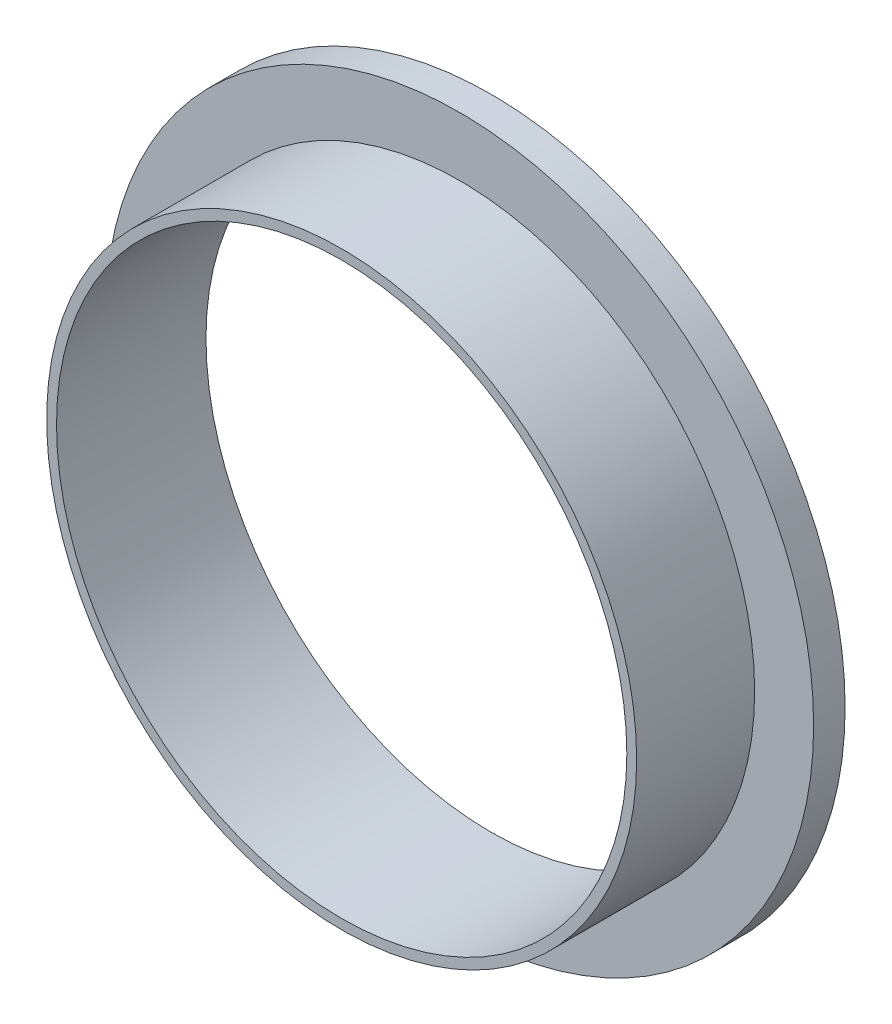
ISO-10303-21;
HEADER;
FILE_DESCRIPTION(('STEP AP214'),'2;1');
FILE_NAME('part.step','',(''),(''),'','','');
FILE_SCHEMA(('AUTOMOTIVE_DESIGN { 1 0 10303 214 1 1 1 1 }'));
ENDSEC;
DATA;
#1=APPLICATION_CONTEXT('core data for automotive mechanical design processes');
#2=APPLICATION_PROTOCOL_DEFINITION('international standard','automotive_design',2000,#1);
#3=PRODUCT_CONTEXT('',#1,'mechanical');
#4=PRODUCT('Part','Part','',(#3));
#5=PRODUCT_RELATED_PRODUCT_CATEGORY('part','',(#4));
#6=PRODUCT_DEFINITION_FORMATION('','',#4);
#7=PRODUCT_DEFINITION_CONTEXT('part definition',#1,'design');
#8=PRODUCT_DEFINITION('design','',#6,#7);
#9=PRODUCT_DEFINITION_SHAPE('','',#8);
#10=(LENGTH_UNIT() NAMED_UNIT(*) SI_UNIT(.MILLI.,.METRE.));
#11=(NAMED_UNIT(*) PLANE_ANGLE_UNIT() SI_UNIT($,.RADIAN.));
#12=(NAMED_UNIT(*) SI_UNIT($,.STERADIAN.) SOLID_ANGLE_UNIT());
#13=UNCERTAINTY_MEASURE_WITH_UNIT(LENGTH_MEASURE(1.E-05),#10,'distance_accuracy_value','');
#14=(GEOMETRIC_REPRESENTATION_CONTEXT(3) GLOBAL_UNCERTAINTY_ASSIGNED_CONTEXT((#13)) GLOBAL_UNIT_ASSIGNED_CONTEXT((#10,
#11,#12)) REPRESENTATION_CONTEXT('',''));
#15=CARTESIAN_POINT('',(0.,0.,0.));
#16=DIRECTION('',(0.,0.,1.));
#17=DIRECTION('',(1.,0.,0.));
#18=AXIS2_PLACEMENT_3D('',#15,#16,#17);
#19=CARTESIAN_POINT('',(0.,0.,8.));
#20=DIRECTION('',(0.,0.,1.));
#21=DIRECTION('',(1.,0.,0.));
#22=AXIS2_PLACEMENT_3D('',#19,#20,#21);
#23=PLANE('',#22);
#24=CARTESIAN_POINT('',(0.,0.,8.));
#25=DIRECTION('',(0.,0.,1.));
#26=DIRECTION('',(1.,0.,0.));
#27=AXIS2_PLACEMENT_3D('',#24,#25,#26);
#28=CIRCLE('',#27,90.);
#29=CARTESIAN_POINT('',(90.,0.,8.));
#30=VERTEX_POINT('',#29);
#31=EDGE_CURVE('E10',#30,#30,#28,.T.);
#32=ORIENTED_EDGE('',*,*,#31,.T.);
#33=EDGE_LOOP('',(#32));
#34=FACE_BOUND('',#33,.T.);
#35=CARTESIAN_POINT('',(0.,0.,8.));
#36=DIRECTION('',(0.,0.,1.));
#37=DIRECTION('',(1.,0.,0.));
#38=AXIS2_PLACEMENT_3D('',#35,#36,#37);
#39=CIRCLE('',#38,75.);
#40=CARTESIAN_POINT('',(75.,0.,8.));
#41=VERTEX_POINT('',#40);
#42=EDGE_CURVE('E56',#41,#41,#39,.T.);
#43=ORIENTED_EDGE('',*,*,#42,.F.);
#44=EDGE_LOOP('',(#43));
#45=FACE_BOUND('',#44,.T.);
#46=ADVANCED_FACE('F37',(#34,#45),#23,.T.);
#47=CARTESIAN_POINT('',(0.,0.,0.));
#48=DIRECTION('',(0.,0.,1.));
#49=DIRECTION('',(1.,0.,0.));
#50=AXIS2_PLACEMENT_3D('',#47,#48,#49);
#51=PLANE('',#50);
#52=CARTESIAN_POINT('',(0.,0.,0.));
#53=DIRECTION('',(0.,0.,1.));
#54=DIRECTION('',(1.,0.,0.));
#55=AXIS2_PLACEMENT_3D('',#52,#53,#54);
#56=CIRCLE('',#55,90.);
#57=CARTESIAN_POINT('',(90.,0.,0.));
#58=VERTEX_POINT('',#57);
#59=EDGE_CURVE('E41',#58,#58,#56,.T.);
#60=ORIENTED_EDGE('',*,*,#59,.F.);
#61=EDGE_LOOP('',(#60));
#62=FACE_BOUND('',#61,.T.);
#63=CARTESIAN_POINT('',(0.,0.,0.));
#64=DIRECTION('',(0.,0.,1.));
#65=DIRECTION('',(1.,0.,0.));
#66=AXIS2_PLACEMENT_3D('',#63,#64,#65);
#67=CIRCLE('',#66,72.5);
#68=CARTESIAN_POINT('',(72.5,0.,0.));
#69=VERTEX_POINT('',#68);
#70=EDGE_CURVE('E50',#69,#69,#67,.T.);
#71=ORIENTED_EDGE('',*,*,#70,.T.);
#72=EDGE_LOOP('',(#71));
#73=FACE_BOUND('',#72,.T.);
#74=ADVANCED_FACE('F84',(#62,#73),#51,.F.);
#75=CARTESIAN_POINT('',(0.,0.,8.));
#76=DIRECTION('',(0.,0.,-1.));
#77=DIRECTION('',(-1.,0.,0.));
#78=AXIS2_PLACEMENT_3D('',#75,#76,#77);
#79=CYLINDRICAL_SURFACE('',#78,90.);
#80=ORIENTED_EDGE('',*,*,#31,.F.);
#81=EDGE_LOOP('',(#80));
#82=FACE_BOUND('',#81,.T.);
#83=ORIENTED_EDGE('',*,*,#59,.T.);
#84=EDGE_LOOP('',(#83));
#85=FACE_BOUND('',#84,.T.);
#86=ADVANCED_FACE('F39',(#82,#85),#79,.T.);
#87=CARTESIAN_POINT('',(0.,0.,8.));
#88=DIRECTION('',(0.,0.,-1.));
#89=DIRECTION('',(-1.,0.,0.));
#90=AXIS2_PLACEMENT_3D('',#87,#88,#89);
#91=CYLINDRICAL_SURFACE('',#90,72.5);
#92=ORIENTED_EDGE('',*,*,#70,.F.);
#93=EDGE_LOOP('',(#92));
#94=FACE_BOUND('',#93,.T.);
#95=CARTESIAN_POINT('',(0.,0.,38.));
#96=DIRECTION('',(0.,0.,1.));
#97=DIRECTION('',(1.,0.,0.));
#98=AXIS2_PLACEMENT_3D('',#95,#96,#97);
#99=CIRCLE('',#98,72.5);
#100=CARTESIAN_POINT('',(72.5,0.,38.));
#101=VERTEX_POINT('',#100);
#102=EDGE_CURVE('E60',#101,#101,#99,.T.);
#103=ORIENTED_EDGE('',*,*,#102,.T.);
#104=EDGE_LOOP('',(#103));
#105=FACE_BOUND('',#104,.T.);
#106=ADVANCED_FACE('F68',(#94,#105),#91,.F.);
#107=CARTESIAN_POINT('',(0.,0.,38.));
#108=DIRECTION('',(0.,0.,1.));
#109=DIRECTION('',(1.,0.,0.));
#110=AXIS2_PLACEMENT_3D('',#107,#108,#109);
#111=PLANE('',#110);
#112=CARTESIAN_POINT('',(0.,0.,38.));
#113=DIRECTION('',(0.,0.,1.));
#114=DIRECTION('',(1.,0.,0.));
#115=AXIS2_PLACEMENT_3D('',#112,#113,#114);
#116=CIRCLE('',#115,75.);
#117=CARTESIAN_POINT('',(75.,0.,38.));
#118=VERTEX_POINT('',#117);
#119=EDGE_CURVE('E55',#118,#118,#116,.T.);
#120=ORIENTED_EDGE('',*,*,#119,.T.);
#121=EDGE_LOOP('',(#120));
#122=FACE_BOUND('',#121,.T.);
#123=ORIENTED_EDGE('',*,*,#102,.F.);
#124=EDGE_LOOP('',(#123));
#125=FACE_BOUND('',#124,.T.);
#126=ADVANCED_FACE('F70',(#122,#125),#111,.T.);
#127=CARTESIAN_POINT('',(0.,0.,38.));
#128=DIRECTION('',(0.,0.,-1.));
#129=DIRECTION('',(-1.,0.,0.));
#130=AXIS2_PLACEMENT_3D('',#127,#128,#129);
#131=CYLINDRICAL_SURFACE('',#130,75.);
#132=ORIENTED_EDGE('',*,*,#119,.F.);
#133=EDGE_LOOP('',(#132));
#134=FACE_BOUND('',#133,.T.);
#135=ORIENTED_EDGE('',*,*,#42,.T.);
#136=EDGE_LOOP('',(#135));
#137=FACE_BOUND('',#136,.T.);
#138=ADVANCED_FACE('F72',(#134,#137),#131,.T.);
#139=CLOSED_SHELL('',(#46,#74,#86,#106,#126,#138));
#140=MANIFOLD_SOLID_BREP('B2',#139);
#141=ADVANCED_BREP_SHAPE_REPRESENTATION('',(#18,#140),#14);
#142=SHAPE_DEFINITION_REPRESENTATION(#9,#141);
ENDSEC;
END-ISO-10303-21;
